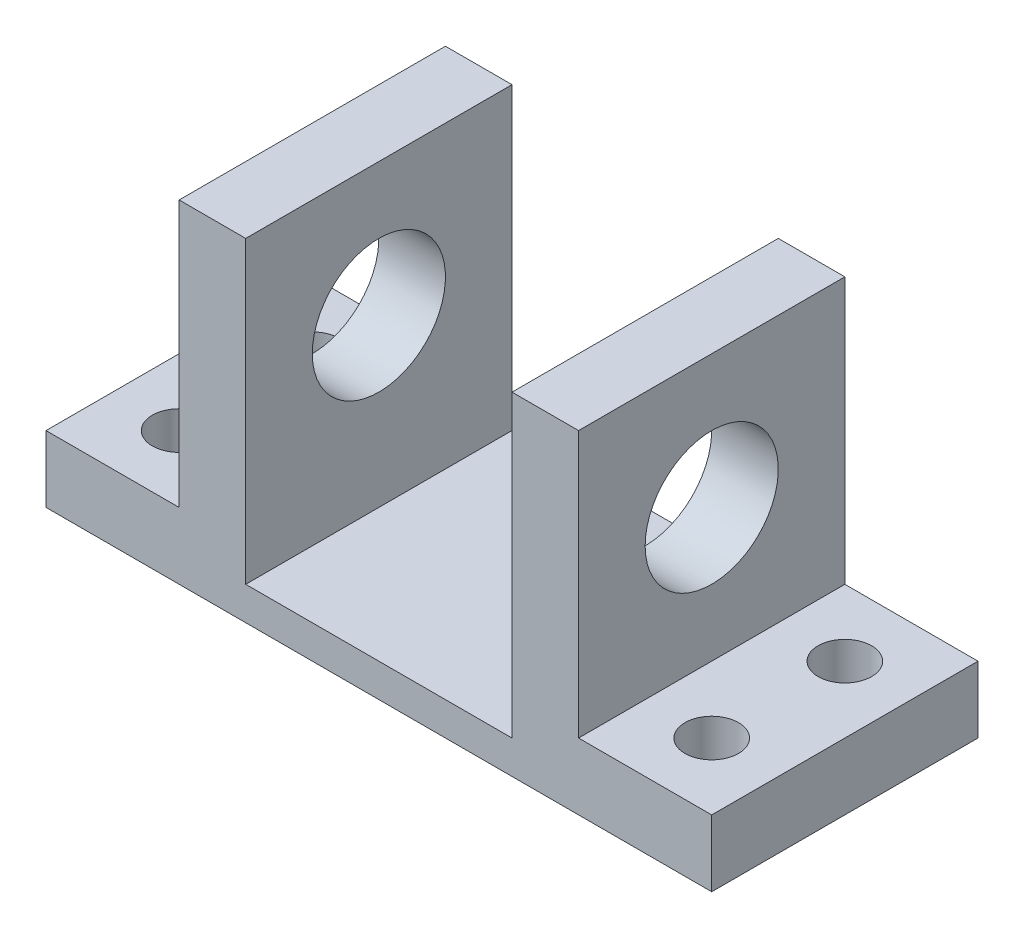
ISO-10303-21;
HEADER;
FILE_DESCRIPTION(('STEP AP214'),'2;1');
FILE_NAME('part.step','',(''),(''),'','','');
FILE_SCHEMA(('AUTOMOTIVE_DESIGN { 1 0 10303 214 1 1 1 1 }'));
ENDSEC;
DATA;
#1=APPLICATION_CONTEXT('core data for automotive mechanical design processes');
#2=APPLICATION_PROTOCOL_DEFINITION('international standard','automotive_design',2000,#1);
#3=PRODUCT_CONTEXT('',#1,'mechanical');
#4=PRODUCT('Part','Part','',(#3));
#5=PRODUCT_RELATED_PRODUCT_CATEGORY('part','',(#4));
#6=PRODUCT_DEFINITION_FORMATION('','',#4);
#7=PRODUCT_DEFINITION_CONTEXT('part definition',#1,'design');
#8=PRODUCT_DEFINITION('design','',#6,#7);
#9=PRODUCT_DEFINITION_SHAPE('','',#8);
#10=(LENGTH_UNIT() NAMED_UNIT(*) SI_UNIT(.MILLI.,.METRE.));
#11=(NAMED_UNIT(*) PLANE_ANGLE_UNIT() SI_UNIT($,.RADIAN.));
#12=(NAMED_UNIT(*) SI_UNIT($,.STERADIAN.) SOLID_ANGLE_UNIT());
#13=UNCERTAINTY_MEASURE_WITH_UNIT(LENGTH_MEASURE(1.E-05),#10,'distance_accuracy_value','');
#14=(GEOMETRIC_REPRESENTATION_CONTEXT(3) GLOBAL_UNCERTAINTY_ASSIGNED_CONTEXT((#13)) GLOBAL_UNIT_ASSIGNED_CONTEXT((#10,
#11,#12)) REPRESENTATION_CONTEXT('',''));
#15=CARTESIAN_POINT('',(0.,0.,0.));
#16=DIRECTION('',(0.,0.,1.));
#17=DIRECTION('',(1.,0.,0.));
#18=AXIS2_PLACEMENT_3D('',#15,#16,#17);
#19=CARTESIAN_POINT('',(38.1,31.75,0.));
#20=DIRECTION('',(-1.,0.,0.));
#21=DIRECTION('',(0.,0.,1.));
#22=AXIS2_PLACEMENT_3D('',#19,#20,#21);
#23=PLANE('',#22);
#24=CARTESIAN_POINT('',(38.1,19.05,-12.7));
#25=DIRECTION('',(-1.,0.,0.));
#26=DIRECTION('',(0.,0.,1.));
#27=AXIS2_PLACEMENT_3D('',#24,#25,#26);
#28=CIRCLE('',#27,6.35);
#29=CARTESIAN_POINT('',(38.1,19.05,-6.35));
#30=VERTEX_POINT('',#29);
#31=EDGE_CURVE('E197',#30,#30,#28,.T.);
#32=ORIENTED_EDGE('',*,*,#31,.T.);
#33=EDGE_LOOP('',(#32));
#34=FACE_BOUND('',#33,.T.);
#35=DIRECTION('',(0.,0.,1.));
#36=VECTOR('',#35,1.);
#37=CARTESIAN_POINT('',(38.1,6.35,0.));
#38=LINE('',#37,#36);
#39=CARTESIAN_POINT('',(38.1,6.35,-25.4));
#40=VERTEX_POINT('',#39);
#41=CARTESIAN_POINT('',(38.1,6.35,0.));
#42=VERTEX_POINT('',#41);
#43=EDGE_CURVE('E54',#40,#42,#38,.T.);
#44=ORIENTED_EDGE('',*,*,#43,.F.);
#45=DIRECTION('',(0.,-1.,0.));
#46=VECTOR('',#45,1.);
#47=CARTESIAN_POINT('',(38.1,31.75,-25.4));
#48=LINE('',#47,#46);
#49=CARTESIAN_POINT('',(38.1,31.75,-25.4));
#50=VERTEX_POINT('',#49);
#51=EDGE_CURVE('E227',#50,#40,#48,.T.);
#52=ORIENTED_EDGE('',*,*,#51,.F.);
#53=DIRECTION('',(0.,0.,-1.));
#54=VECTOR('',#53,1.);
#55=CARTESIAN_POINT('',(38.1,31.75,0.));
#56=LINE('',#55,#54);
#57=CARTESIAN_POINT('',(38.1,31.75,0.));
#58=VERTEX_POINT('',#57);
#59=EDGE_CURVE('E215',#58,#50,#56,.T.);
#60=ORIENTED_EDGE('',*,*,#59,.F.);
#61=DIRECTION('',(0.,-1.,0.));
#62=VECTOR('',#61,1.);
#63=CARTESIAN_POINT('',(38.1,31.75,0.));
#64=LINE('',#63,#62);
#65=EDGE_CURVE('E168',#58,#42,#64,.T.);
#66=ORIENTED_EDGE('',*,*,#65,.T.);
#67=EDGE_LOOP('',(#44,#52,#60,#66));
#68=FACE_BOUND('',#67,.T.);
#69=ADVANCED_FACE('F37',(#34,#68),#23,.F.);
#70=CARTESIAN_POINT('',(0.,31.75,-25.4));
#71=DIRECTION('',(0.,0.,-1.));
#72=DIRECTION('',(-1.,0.,0.));
#73=AXIS2_PLACEMENT_3D('',#70,#71,#72);
#74=PLANE('',#73);
#75=DIRECTION('',(1.,0.,0.));
#76=VECTOR('',#75,1.);
#77=CARTESIAN_POINT('',(0.,0.,-25.4));
#78=LINE('',#77,#76);
#79=CARTESIAN_POINT('',(-12.7,0.,-25.4));
#80=VERTEX_POINT('',#79);
#81=CARTESIAN_POINT('',(50.8,0.,-25.4));
#82=VERTEX_POINT('',#81);
#83=EDGE_CURVE('E140',#80,#82,#78,.T.);
#84=ORIENTED_EDGE('',*,*,#83,.F.);
#85=DIRECTION('',(0.,-1.,0.));
#86=VECTOR('',#85,1.);
#87=CARTESIAN_POINT('',(-12.7,0.,-25.4));
#88=LINE('',#87,#86);
#89=CARTESIAN_POINT('',(-12.7,6.35,-25.4));
#90=VERTEX_POINT('',#89);
#91=EDGE_CURVE('E164',#90,#80,#88,.T.);
#92=ORIENTED_EDGE('',*,*,#91,.F.);
#93=DIRECTION('',(1.,0.,0.));
#94=VECTOR('',#93,1.);
#95=CARTESIAN_POINT('',(-12.7,6.35,-25.4));
#96=LINE('',#95,#94);
#97=CARTESIAN_POINT('',(0.,6.35,-25.4));
#98=VERTEX_POINT('',#97);
#99=EDGE_CURVE('E190',#90,#98,#96,.T.);
#100=ORIENTED_EDGE('',*,*,#99,.T.);
#101=DIRECTION('',(0.,-1.,0.));
#102=VECTOR('',#101,1.);
#103=CARTESIAN_POINT('',(0.,31.75,-25.4));
#104=LINE('',#103,#102);
#105=CARTESIAN_POINT('',(0.,31.75,-25.4));
#106=VERTEX_POINT('',#105);
#107=EDGE_CURVE('E11',#106,#98,#104,.T.);
#108=ORIENTED_EDGE('',*,*,#107,.F.);
#109=DIRECTION('',(1.,0.,0.));
#110=VECTOR('',#109,1.);
#111=CARTESIAN_POINT('',(0.,31.75,-25.4));
#112=LINE('',#111,#110);
#113=CARTESIAN_POINT('',(6.35,31.75,-25.4));
#114=VERTEX_POINT('',#113);
#115=EDGE_CURVE('E139',#106,#114,#112,.T.);
#116=ORIENTED_EDGE('',*,*,#115,.T.);
#117=DIRECTION('',(0.,-1.,0.));
#118=VECTOR('',#117,1.);
#119=CARTESIAN_POINT('',(6.35,31.75,-25.4));
#120=LINE('',#119,#118);
#121=CARTESIAN_POINT('',(6.35,3.175,-25.4));
#122=VERTEX_POINT('',#121);
#123=EDGE_CURVE('E250',#114,#122,#120,.T.);
#124=ORIENTED_EDGE('',*,*,#123,.T.);
#125=DIRECTION('',(1.,0.,0.));
#126=VECTOR('',#125,1.);
#127=CARTESIAN_POINT('',(0.,3.175,-25.4));
#128=LINE('',#127,#126);
#129=CARTESIAN_POINT('',(31.75,3.175,-25.4));
#130=VERTEX_POINT('',#129);
#131=EDGE_CURVE('E238',#122,#130,#128,.T.);
#132=ORIENTED_EDGE('',*,*,#131,.T.);
#133=DIRECTION('',(0.,-1.,0.));
#134=VECTOR('',#133,1.);
#135=CARTESIAN_POINT('',(31.75,31.75,-25.4));
#136=LINE('',#135,#134);
#137=CARTESIAN_POINT('',(31.75,31.75,-25.4));
#138=VERTEX_POINT('',#137);
#139=EDGE_CURVE('E220',#138,#130,#136,.T.);
#140=ORIENTED_EDGE('',*,*,#139,.F.);
#141=DIRECTION('',(1.,0.,0.));
#142=VECTOR('',#141,1.);
#143=CARTESIAN_POINT('',(0.,31.75,-25.4));
#144=LINE('',#143,#142);
#145=EDGE_CURVE('E217',#138,#50,#144,.T.);
#146=ORIENTED_EDGE('',*,*,#145,.T.);
#147=ORIENTED_EDGE('',*,*,#51,.T.);
#148=DIRECTION('',(-1.,0.,0.));
#149=VECTOR('',#148,1.);
#150=CARTESIAN_POINT('',(50.8,6.35,-25.4));
#151=LINE('',#150,#149);
#152=CARTESIAN_POINT('',(50.8,6.35,-25.4));
#153=VERTEX_POINT('',#152);
#154=EDGE_CURVE('E172',#153,#40,#151,.T.);
#155=ORIENTED_EDGE('',*,*,#154,.F.);
#156=DIRECTION('',(0.,1.,0.));
#157=VECTOR('',#156,1.);
#158=CARTESIAN_POINT('',(50.8,0.,-25.4));
#159=LINE('',#158,#157);
#160=EDGE_CURVE('E147',#82,#153,#159,.T.);
#161=ORIENTED_EDGE('',*,*,#160,.F.);
#162=EDGE_LOOP('',(#84,#92,#100,#108,#116,#124,#132,#140,#146,#147,#155,#161));
#163=FACE_BOUND('',#162,.T.);
#164=ADVANCED_FACE('F39',(#163),#74,.T.);
#165=CARTESIAN_POINT('',(0.,31.75,0.));
#166=DIRECTION('',(-1.,0.,0.));
#167=DIRECTION('',(0.,0.,1.));
#168=AXIS2_PLACEMENT_3D('',#165,#166,#167);
#169=PLANE('',#168);
#170=DIRECTION('',(0.,0.,-1.));
#171=VECTOR('',#170,1.);
#172=CARTESIAN_POINT('',(0.,6.35,-25.4));
#173=LINE('',#172,#171);
#174=CARTESIAN_POINT('',(0.,6.35,0.));
#175=VERTEX_POINT('',#174);
#176=EDGE_CURVE('E61',#175,#98,#173,.T.);
#177=ORIENTED_EDGE('',*,*,#176,.F.);
#178=DIRECTION('',(0.,-1.,0.));
#179=VECTOR('',#178,1.);
#180=CARTESIAN_POINT('',(0.,31.75,0.));
#181=LINE('',#180,#179);
#182=CARTESIAN_POINT('',(0.,31.75,0.));
#183=VERTEX_POINT('',#182);
#184=EDGE_CURVE('E46',#183,#175,#181,.T.);
#185=ORIENTED_EDGE('',*,*,#184,.F.);
#186=DIRECTION('',(0.,0.,-1.));
#187=VECTOR('',#186,1.);
#188=CARTESIAN_POINT('',(0.,31.75,0.));
#189=LINE('',#188,#187);
#190=EDGE_CURVE('E262',#183,#106,#189,.T.);
#191=ORIENTED_EDGE('',*,*,#190,.T.);
#192=ORIENTED_EDGE('',*,*,#107,.T.);
#193=EDGE_LOOP('',(#177,#185,#191,#192));
#194=FACE_BOUND('',#193,.T.);
#195=CARTESIAN_POINT('',(0.,19.05,-12.7));
#196=DIRECTION('',(-1.,0.,0.));
#197=DIRECTION('',(0.,0.,1.));
#198=AXIS2_PLACEMENT_3D('',#195,#196,#197);
#199=CIRCLE('',#198,6.35);
#200=CARTESIAN_POINT('',(0.,19.05,-6.35));
#201=VERTEX_POINT('',#200);
#202=EDGE_CURVE('E201',#201,#201,#199,.T.);
#203=ORIENTED_EDGE('',*,*,#202,.F.);
#204=EDGE_LOOP('',(#203));
#205=FACE_BOUND('',#204,.T.);
#206=ADVANCED_FACE('F273',(#194,#205),#169,.T.);
#207=CARTESIAN_POINT('',(0.,31.75,0.));
#208=DIRECTION('',(0.,0.,-1.));
#209=DIRECTION('',(-1.,0.,0.));
#210=AXIS2_PLACEMENT_3D('',#207,#208,#209);
#211=PLANE('',#210);
#212=DIRECTION('',(1.,0.,0.));
#213=VECTOR('',#212,1.);
#214=CARTESIAN_POINT('',(0.,0.,0.));
#215=LINE('',#214,#213);
#216=CARTESIAN_POINT('',(-12.7,0.,0.));
#217=VERTEX_POINT('',#216);
#218=CARTESIAN_POINT('',(50.8,0.,0.));
#219=VERTEX_POINT('',#218);
#220=EDGE_CURVE('E128',#217,#219,#215,.T.);
#221=ORIENTED_EDGE('',*,*,#220,.T.);
#222=DIRECTION('',(0.,-1.,0.));
#223=VECTOR('',#222,1.);
#224=CARTESIAN_POINT('',(50.8,0.,0.));
#225=LINE('',#224,#223);
#226=CARTESIAN_POINT('',(50.8,6.35,0.));
#227=VERTEX_POINT('',#226);
#228=EDGE_CURVE('E133',#227,#219,#225,.T.);
#229=ORIENTED_EDGE('',*,*,#228,.F.);
#230=DIRECTION('',(-1.,0.,0.));
#231=VECTOR('',#230,1.);
#232=CARTESIAN_POINT('',(50.8,6.35,0.));
#233=LINE('',#232,#231);
#234=EDGE_CURVE('E161',#227,#42,#233,.T.);
#235=ORIENTED_EDGE('',*,*,#234,.T.);
#236=ORIENTED_EDGE('',*,*,#65,.F.);
#237=DIRECTION('',(1.,0.,0.));
#238=VECTOR('',#237,1.);
#239=CARTESIAN_POINT('',(0.,31.75,0.));
#240=LINE('',#239,#238);
#241=CARTESIAN_POINT('',(31.75,31.75,0.));
#242=VERTEX_POINT('',#241);
#243=EDGE_CURVE('E213',#242,#58,#240,.T.);
#244=ORIENTED_EDGE('',*,*,#243,.F.);
#245=DIRECTION('',(0.,-1.,0.));
#246=VECTOR('',#245,1.);
#247=CARTESIAN_POINT('',(31.75,31.75,0.));
#248=LINE('',#247,#246);
#249=CARTESIAN_POINT('',(31.75,3.175,0.));
#250=VERTEX_POINT('',#249);
#251=EDGE_CURVE('E228',#242,#250,#248,.T.);
#252=ORIENTED_EDGE('',*,*,#251,.T.);
#253=DIRECTION('',(1.,0.,0.));
#254=VECTOR('',#253,1.);
#255=CARTESIAN_POINT('',(0.,3.175,0.));
#256=LINE('',#255,#254);
#257=CARTESIAN_POINT('',(6.35,3.175,0.));
#258=VERTEX_POINT('',#257);
#259=EDGE_CURVE('E239',#258,#250,#256,.T.);
#260=ORIENTED_EDGE('',*,*,#259,.F.);
#261=DIRECTION('',(0.,-1.,0.));
#262=VECTOR('',#261,1.);
#263=CARTESIAN_POINT('',(6.35,31.75,0.));
#264=LINE('',#263,#262);
#265=CARTESIAN_POINT('',(6.35,31.75,0.));
#266=VERTEX_POINT('',#265);
#267=EDGE_CURVE('E243',#266,#258,#264,.T.);
#268=ORIENTED_EDGE('',*,*,#267,.F.);
#269=DIRECTION('',(1.,0.,0.));
#270=VECTOR('',#269,1.);
#271=CARTESIAN_POINT('',(0.,31.75,0.));
#272=LINE('',#271,#270);
#273=EDGE_CURVE('E260',#183,#266,#272,.T.);
#274=ORIENTED_EDGE('',*,*,#273,.F.);
#275=ORIENTED_EDGE('',*,*,#184,.T.);
#276=DIRECTION('',(1.,0.,0.));
#277=VECTOR('',#276,1.);
#278=CARTESIAN_POINT('',(-12.7,6.35,0.));
#279=LINE('',#278,#277);
#280=CARTESIAN_POINT('',(-12.7,6.35,0.));
#281=VERTEX_POINT('',#280);
#282=EDGE_CURVE('E204',#281,#175,#279,.T.);
#283=ORIENTED_EDGE('',*,*,#282,.F.);
#284=DIRECTION('',(0.,1.,0.));
#285=VECTOR('',#284,1.);
#286=CARTESIAN_POINT('',(-12.7,0.,0.));
#287=LINE('',#286,#285);
#288=EDGE_CURVE('E135',#217,#281,#287,.T.);
#289=ORIENTED_EDGE('',*,*,#288,.F.);
#290=EDGE_LOOP('',(#221,#229,#235,#236,#244,#252,#260,#268,#274,#275,#283,#289));
#291=FACE_BOUND('',#290,.T.);
#292=ADVANCED_FACE('F130',(#291),#211,.F.);
#293=CARTESIAN_POINT('',(6.35,31.75,0.));
#294=DIRECTION('',(-1.,0.,0.));
#295=DIRECTION('',(0.,0.,1.));
#296=AXIS2_PLACEMENT_3D('',#293,#294,#295);
#297=PLANE('',#296);
#298=CARTESIAN_POINT('',(6.35,19.05,-12.7));
#299=DIRECTION('',(-1.,0.,0.));
#300=DIRECTION('',(0.,0.,1.));
#301=AXIS2_PLACEMENT_3D('',#298,#299,#300);
#302=CIRCLE('',#301,6.35);
#303=CARTESIAN_POINT('',(6.35000000000001,19.05,-6.35));
#304=VERTEX_POINT('',#303);
#305=EDGE_CURVE('E207',#304,#304,#302,.T.);
#306=ORIENTED_EDGE('',*,*,#305,.T.);
#307=EDGE_LOOP('',(#306));
#308=FACE_BOUND('',#307,.T.);
#309=ORIENTED_EDGE('',*,*,#267,.T.);
#310=DIRECTION('',(0.,0.,-1.));
#311=VECTOR('',#310,1.);
#312=CARTESIAN_POINT('',(6.35,3.175,0.));
#313=LINE('',#312,#311);
#314=EDGE_CURVE('E258',#258,#122,#313,.T.);
#315=ORIENTED_EDGE('',*,*,#314,.T.);
#316=ORIENTED_EDGE('',*,*,#123,.F.);
#317=DIRECTION('',(0.,0.,-1.));
#318=VECTOR('',#317,1.);
#319=CARTESIAN_POINT('',(6.35,31.75,0.));
#320=LINE('',#319,#318);
#321=EDGE_CURVE('E253',#266,#114,#320,.T.);
#322=ORIENTED_EDGE('',*,*,#321,.F.);
#323=EDGE_LOOP('',(#309,#315,#316,#322));
#324=FACE_BOUND('',#323,.T.);
#325=ADVANCED_FACE('F283',(#308,#324),#297,.F.);
#326=CARTESIAN_POINT('',(0.,31.75,0.));
#327=DIRECTION('',(0.,1.,0.));
#328=DIRECTION('',(0.,0.,1.));
#329=AXIS2_PLACEMENT_3D('',#326,#327,#328);
#330=PLANE('',#329);
#331=ORIENTED_EDGE('',*,*,#115,.F.);
#332=ORIENTED_EDGE('',*,*,#190,.F.);
#333=ORIENTED_EDGE('',*,*,#273,.T.);
#334=ORIENTED_EDGE('',*,*,#321,.T.);
#335=EDGE_LOOP('',(#331,#332,#333,#334));
#336=FACE_BOUND('',#335,.T.);
#337=ADVANCED_FACE('F271',(#336),#330,.T.);
#338=CARTESIAN_POINT('',(0.,0.,0.));
#339=DIRECTION('',(0.,1.,0.));
#340=DIRECTION('',(0.,0.,1.));
#341=AXIS2_PLACEMENT_3D('',#338,#339,#340);
#342=PLANE('',#341);
#343=CARTESIAN_POINT('',(-6.35,0.,-19.05));
#344=DIRECTION('',(0.,1.,0.));
#345=DIRECTION('',(0.,0.,1.));
#346=AXIS2_PLACEMENT_3D('',#343,#344,#345);
#347=CIRCLE('',#346,2.55269999999999);
#348=CARTESIAN_POINT('',(-6.35,0.,-16.4973));
#349=VERTEX_POINT('',#348);
#350=EDGE_CURVE('E366',#349,#349,#347,.T.);
#351=ORIENTED_EDGE('',*,*,#350,.T.);
#352=EDGE_LOOP('',(#351));
#353=FACE_BOUND('',#352,.T.);
#354=CARTESIAN_POINT('',(-6.35,0.,-6.35));
#355=DIRECTION('',(0.,1.,0.));
#356=DIRECTION('',(0.,0.,1.));
#357=AXIS2_PLACEMENT_3D('',#354,#355,#356);
#358=CIRCLE('',#357,2.55269999999999);
#359=CARTESIAN_POINT('',(-6.35,0.,-3.79730000000001));
#360=VERTEX_POINT('',#359);
#361=EDGE_CURVE('E41',#360,#360,#358,.T.);
#362=ORIENTED_EDGE('',*,*,#361,.T.);
#363=EDGE_LOOP('',(#362));
#364=FACE_BOUND('',#363,.T.);
#365=CARTESIAN_POINT('',(44.45,0.,-6.35));
#366=DIRECTION('',(0.,1.,0.));
#367=DIRECTION('',(0.,0.,1.));
#368=AXIS2_PLACEMENT_3D('',#365,#366,#367);
#369=CIRCLE('',#368,2.55269999999999);
#370=CARTESIAN_POINT('',(44.45,0.,-3.79730000000001));
#371=VERTEX_POINT('',#370);
#372=EDGE_CURVE('E376',#371,#371,#369,.T.);
#373=ORIENTED_EDGE('',*,*,#372,.T.);
#374=EDGE_LOOP('',(#373));
#375=FACE_BOUND('',#374,.T.);
#376=CARTESIAN_POINT('',(44.45,0.,-19.05));
#377=DIRECTION('',(0.,1.,0.));
#378=DIRECTION('',(0.,0.,1.));
#379=AXIS2_PLACEMENT_3D('',#376,#377,#378);
#380=CIRCLE('',#379,2.55269999999999);
#381=CARTESIAN_POINT('',(44.45,0.,-16.4973));
#382=VERTEX_POINT('',#381);
#383=EDGE_CURVE('E154',#382,#382,#380,.T.);
#384=ORIENTED_EDGE('',*,*,#383,.T.);
#385=EDGE_LOOP('',(#384));
#386=FACE_BOUND('',#385,.T.);
#387=ORIENTED_EDGE('',*,*,#83,.T.);
#388=DIRECTION('',(0.,0.,-1.));
#389=VECTOR('',#388,1.);
#390=CARTESIAN_POINT('',(50.8,0.,0.));
#391=LINE('',#390,#389);
#392=EDGE_CURVE('E143',#219,#82,#391,.T.);
#393=ORIENTED_EDGE('',*,*,#392,.F.);
#394=ORIENTED_EDGE('',*,*,#220,.F.);
#395=DIRECTION('',(0.,0.,1.));
#396=VECTOR('',#395,1.);
#397=CARTESIAN_POINT('',(-12.7,0.,-25.4));
#398=LINE('',#397,#396);
#399=EDGE_CURVE('E185',#80,#217,#398,.T.);
#400=ORIENTED_EDGE('',*,*,#399,.F.);
#401=EDGE_LOOP('',(#387,#393,#394,#400));
#402=FACE_BOUND('',#401,.T.);
#403=ADVANCED_FACE('F144',(#353,#364,#375,#386,#402),#342,.F.);
#404=CARTESIAN_POINT('',(0.,3.175,0.));
#405=DIRECTION('',(0.,1.,0.));
#406=DIRECTION('',(0.,0.,1.));
#407=AXIS2_PLACEMENT_3D('',#404,#405,#406);
#408=PLANE('',#407);
#409=ORIENTED_EDGE('',*,*,#259,.T.);
#410=DIRECTION('',(0.,0.,-1.));
#411=VECTOR('',#410,1.);
#412=CARTESIAN_POINT('',(31.75,3.175,0.));
#413=LINE('',#412,#411);
#414=EDGE_CURVE('E235',#250,#130,#413,.T.);
#415=ORIENTED_EDGE('',*,*,#414,.T.);
#416=ORIENTED_EDGE('',*,*,#131,.F.);
#417=ORIENTED_EDGE('',*,*,#314,.F.);
#418=EDGE_LOOP('',(#409,#415,#416,#417));
#419=FACE_BOUND('',#418,.T.);
#420=ADVANCED_FACE('F306',(#419),#408,.T.);
#421=CARTESIAN_POINT('',(31.75,31.75,0.));
#422=DIRECTION('',(-1.,0.,0.));
#423=DIRECTION('',(0.,0.,1.));
#424=AXIS2_PLACEMENT_3D('',#421,#422,#423);
#425=PLANE('',#424);
#426=CARTESIAN_POINT('',(31.75,19.05,-12.7));
#427=DIRECTION('',(-1.,0.,0.));
#428=DIRECTION('',(0.,0.,1.));
#429=AXIS2_PLACEMENT_3D('',#426,#427,#428);
#430=CIRCLE('',#429,6.35);
#431=CARTESIAN_POINT('',(31.75,19.05,-6.35));
#432=VERTEX_POINT('',#431);
#433=EDGE_CURVE('E200',#432,#432,#430,.T.);
#434=ORIENTED_EDGE('',*,*,#433,.F.);
#435=EDGE_LOOP('',(#434));
#436=FACE_BOUND('',#435,.T.);
#437=ORIENTED_EDGE('',*,*,#414,.F.);
#438=ORIENTED_EDGE('',*,*,#251,.F.);
#439=DIRECTION('',(0.,0.,-1.));
#440=VECTOR('',#439,1.);
#441=CARTESIAN_POINT('',(31.75,31.75,0.));
#442=LINE('',#441,#440);
#443=EDGE_CURVE('E210',#242,#138,#442,.T.);
#444=ORIENTED_EDGE('',*,*,#443,.T.);
#445=ORIENTED_EDGE('',*,*,#139,.T.);
#446=EDGE_LOOP('',(#437,#438,#444,#445));
#447=FACE_BOUND('',#446,.T.);
#448=ADVANCED_FACE('F305',(#436,#447),#425,.T.);
#449=CARTESIAN_POINT('',(0.,31.75,0.));
#450=DIRECTION('',(0.,1.,0.));
#451=DIRECTION('',(0.,0.,1.));
#452=AXIS2_PLACEMENT_3D('',#449,#450,#451);
#453=PLANE('',#452);
#454=ORIENTED_EDGE('',*,*,#443,.F.);
#455=ORIENTED_EDGE('',*,*,#243,.T.);
#456=ORIENTED_EDGE('',*,*,#59,.T.);
#457=ORIENTED_EDGE('',*,*,#145,.F.);
#458=EDGE_LOOP('',(#454,#455,#456,#457));
#459=FACE_BOUND('',#458,.T.);
#460=ADVANCED_FACE('F303',(#459),#453,.T.);
#461=CARTESIAN_POINT('',(38.1,19.05,-12.7));
#462=DIRECTION('',(-1.,0.,0.));
#463=DIRECTION('',(0.,0.,1.));
#464=AXIS2_PLACEMENT_3D('',#461,#462,#463);
#465=CYLINDRICAL_SURFACE('',#464,6.35);
#466=CARTESIAN_POINT('',(31.75,19.05,-6.35));
#467=CARTESIAN_POINT('',(31.8161458333333,19.05,-6.35));
#468=CARTESIAN_POINT('',(31.8822916666667,19.05,-6.35));
#469=CARTESIAN_POINT('',(32.0145833333333,19.05,-6.35));
#470=CARTESIAN_POINT('',(32.0807291666667,19.05,-6.35));
#471=CARTESIAN_POINT('',(32.2130208333333,19.05,-6.35));
#472=CARTESIAN_POINT('',(32.2791666666667,19.05,-6.35));
#473=CARTESIAN_POINT('',(32.4114583333333,19.05,-6.35));
#474=CARTESIAN_POINT('',(32.4776041666667,19.05,-6.35));
#475=CARTESIAN_POINT('',(32.6098958333333,19.05,-6.35));
#476=CARTESIAN_POINT('',(32.6760416666667,19.05,-6.35));
#477=CARTESIAN_POINT('',(32.8083333333333,19.05,-6.35));
#478=CARTESIAN_POINT('',(32.8744791666667,19.05,-6.35));
#479=CARTESIAN_POINT('',(33.0067708333333,19.05,-6.35));
#480=CARTESIAN_POINT('',(33.0729166666667,19.05,-6.35));
#481=CARTESIAN_POINT('',(33.2052083333333,19.05,-6.35));
#482=CARTESIAN_POINT('',(33.2713541666667,19.05,-6.35));
#483=CARTESIAN_POINT('',(33.4036458333333,19.05,-6.35));
#484=CARTESIAN_POINT('',(33.4697916666667,19.05,-6.35));
#485=CARTESIAN_POINT('',(33.6020833333333,19.05,-6.35));
#486=CARTESIAN_POINT('',(33.6682291666667,19.05,-6.35));
#487=CARTESIAN_POINT('',(33.8005208333333,19.05,-6.35));
#488=CARTESIAN_POINT('',(33.8666666666667,19.05,-6.35));
#489=CARTESIAN_POINT('',(33.9989583333333,19.05,-6.35));
#490=CARTESIAN_POINT('',(34.0651041666667,19.05,-6.35));
#491=CARTESIAN_POINT('',(34.1973958333333,19.05,-6.35));
#492=CARTESIAN_POINT('',(34.2635416666667,19.05,-6.35));
#493=CARTESIAN_POINT('',(34.3958333333333,19.05,-6.35));
#494=CARTESIAN_POINT('',(34.4619791666667,19.05,-6.35));
#495=CARTESIAN_POINT('',(34.5942708333333,19.05,-6.35));
#496=CARTESIAN_POINT('',(34.6604166666667,19.05,-6.35));
#497=CARTESIAN_POINT('',(34.7927083333333,19.05,-6.35));
#498=CARTESIAN_POINT('',(34.8588541666667,19.05,-6.35));
#499=CARTESIAN_POINT('',(34.9911458333333,19.05,-6.35));
#500=CARTESIAN_POINT('',(35.0572916666667,19.05,-6.35));
#501=CARTESIAN_POINT('',(35.1895833333333,19.05,-6.35));
#502=CARTESIAN_POINT('',(35.2557291666667,19.05,-6.35));
#503=CARTESIAN_POINT('',(35.3880208333333,19.05,-6.35));
#504=CARTESIAN_POINT('',(35.4541666666667,19.05,-6.35));
#505=CARTESIAN_POINT('',(35.5864583333333,19.05,-6.35));
#506=CARTESIAN_POINT('',(35.6526041666667,19.05,-6.35));
#507=CARTESIAN_POINT('',(35.7848958333333,19.05,-6.35));
#508=CARTESIAN_POINT('',(35.8510416666667,19.05,-6.35));
#509=CARTESIAN_POINT('',(35.9833333333333,19.05,-6.35));
#510=CARTESIAN_POINT('',(36.0494791666667,19.05,-6.35));
#511=CARTESIAN_POINT('',(36.1817708333333,19.05,-6.35));
#512=CARTESIAN_POINT('',(36.2479166666667,19.05,-6.35));
#513=CARTESIAN_POINT('',(36.3802083333333,19.05,-6.35));
#514=CARTESIAN_POINT('',(36.4463541666667,19.05,-6.35));
#515=CARTESIAN_POINT('',(36.5786458333333,19.05,-6.35));
#516=CARTESIAN_POINT('',(36.6447916666667,19.05,-6.35));
#517=CARTESIAN_POINT('',(36.7770833333333,19.05,-6.35));
#518=CARTESIAN_POINT('',(36.8432291666667,19.05,-6.35));
#519=CARTESIAN_POINT('',(36.9755208333333,19.05,-6.35));
#520=CARTESIAN_POINT('',(37.0416666666667,19.05,-6.35));
#521=CARTESIAN_POINT('',(37.1739583333333,19.05,-6.35));
#522=CARTESIAN_POINT('',(37.2401041666667,19.05,-6.35));
#523=CARTESIAN_POINT('',(37.3723958333333,19.05,-6.35));
#524=CARTESIAN_POINT('',(37.4385416666667,19.05,-6.35));
#525=CARTESIAN_POINT('',(37.5708333333333,19.05,-6.35));
#526=CARTESIAN_POINT('',(37.6369791666667,19.05,-6.35));
#527=CARTESIAN_POINT('',(37.7692708333333,19.05,-6.35));
#528=CARTESIAN_POINT('',(37.8354166666667,19.05,-6.35));
#529=CARTESIAN_POINT('',(37.9677083333333,19.05,-6.35));
#530=CARTESIAN_POINT('',(38.0338541666667,19.05,-6.35));
#531=CARTESIAN_POINT('',(38.1,19.05,-6.35));
#532=B_SPLINE_CURVE_WITH_KNOTS('',3,(#466,#467,#468,#469,#470,#471,#472,#473,#474,#475,#476,
#477,#478,#479,#480,#481,#482,#483,#484,#485,#486,#487,#488,#489,#490,#491,#492,#493,#494,#495,
#496,#497,#498,#499,#500,#501,#502,#503,#504,#505,#506,#507,#508,#509,#510,#511,#512,#513,#514,
#515,#516,#517,#518,#519,#520,#521,#522,#523,#524,#525,#526,#527,#528,#529,#530,#531),
.UNSPECIFIED.,.F.,.F.,(4,2,2,2,2,2,2,2,2,2,2,2,2,2,2,2,2,2,2,2,2,2,2,2,2,2,2,2,2,2,2,2,4),(0.,
0.198437499999995,0.396874999999998,0.5953125,0.793749999999996,0.992187499999998,1.190625,
1.3890625,1.5875,1.78593749999999,1.984375,2.1828125,2.38124999999999,2.5796875,2.778125,
2.97656249999999,3.175,3.3734375,3.571875,3.7703125,3.96875,4.1671875,4.365625,4.5640625,4.7625,
4.9609375,5.159375,5.3578125,5.55625,5.7546875,5.953125,6.1515625,6.34999999999999),.UNSPECIFIED.);
#533=EDGE_CURVE('BSEAM327',#432,#30,#532,.T.);
#534=ORIENTED_EDGE('',*,*,#433,.T.);
#535=ORIENTED_EDGE('',*,*,#31,.F.);
#536=ORIENTED_EDGE('',*,*,#533,.T.);
#537=ORIENTED_EDGE('',*,*,#533,.F.);
#538=EDGE_LOOP('',(#534,#536,#535,#537));
#539=FACE_BOUND('',#538,.T.);
#540=ADVANCED_FACE('F327',(#539),#465,.F.);
#541=CARTESIAN_POINT('',(0.,19.05,-6.35));
#542=CARTESIAN_POINT('',(0.0661458333333341,19.05,-6.35));
#543=CARTESIAN_POINT('',(0.132291666666668,19.05,-6.35));
#544=CARTESIAN_POINT('',(0.264583333333334,19.05,-6.35));
#545=CARTESIAN_POINT('',(0.330729166666666,19.05,-6.35));
#546=CARTESIAN_POINT('',(0.463020833333332,19.05,-6.35));
#547=CARTESIAN_POINT('',(0.529166666666666,19.05,-6.35));
#548=CARTESIAN_POINT('',(0.661458333333334,19.05,-6.35));
#549=CARTESIAN_POINT('',(0.727604166666669,19.05,-6.35));
#550=CARTESIAN_POINT('',(0.859895833333335,19.05,-6.35));
#551=CARTESIAN_POINT('',(0.926041666666666,19.05,-6.35));
#552=CARTESIAN_POINT('',(1.05833333333333,19.05,-6.35));
#553=CARTESIAN_POINT('',(1.12447916666667,19.05,-6.35));
#554=CARTESIAN_POINT('',(1.25677083333333,19.05,-6.35));
#555=CARTESIAN_POINT('',(1.32291666666667,19.05,-6.35));
#556=CARTESIAN_POINT('',(1.45520833333334,19.05,-6.35));
#557=CARTESIAN_POINT('',(1.52135416666667,19.05,-6.35));
#558=CARTESIAN_POINT('',(1.65364583333334,19.05,-6.35));
#559=CARTESIAN_POINT('',(1.71979166666667,19.05,-6.35));
#560=CARTESIAN_POINT('',(1.85208333333334,19.05,-6.35));
#561=CARTESIAN_POINT('',(1.91822916666667,19.05,-6.35));
#562=CARTESIAN_POINT('',(2.05052083333334,19.05,-6.35));
#563=CARTESIAN_POINT('',(2.11666666666667,19.05,-6.35));
#564=CARTESIAN_POINT('',(2.24895833333334,19.05,-6.35));
#565=CARTESIAN_POINT('',(2.31510416666667,19.05,-6.35));
#566=CARTESIAN_POINT('',(2.44739583333334,19.05,-6.35));
#567=CARTESIAN_POINT('',(2.51354166666667,19.05,-6.35));
#568=CARTESIAN_POINT('',(2.64583333333334,19.05,-6.35));
#569=CARTESIAN_POINT('',(2.71197916666667,19.05,-6.35));
#570=CARTESIAN_POINT('',(2.84427083333334,19.05,-6.35));
#571=CARTESIAN_POINT('',(2.91041666666667,19.05,-6.35));
#572=CARTESIAN_POINT('',(3.04270833333334,19.05,-6.35));
#573=CARTESIAN_POINT('',(3.10885416666667,19.05,-6.35));
#574=CARTESIAN_POINT('',(3.24114583333334,19.05,-6.35));
#575=CARTESIAN_POINT('',(3.30729166666667,19.05,-6.35));
#576=CARTESIAN_POINT('',(3.43958333333334,19.05,-6.35));
#577=CARTESIAN_POINT('',(3.50572916666667,19.05,-6.35));
#578=CARTESIAN_POINT('',(3.63802083333334,19.05,-6.35));
#579=CARTESIAN_POINT('',(3.70416666666667,19.05,-6.35));
#580=CARTESIAN_POINT('',(3.83645833333334,19.05,-6.35));
#581=CARTESIAN_POINT('',(3.90260416666667,19.05,-6.35));
#582=CARTESIAN_POINT('',(4.03489583333334,19.05,-6.35));
#583=CARTESIAN_POINT('',(4.10104166666667,19.05,-6.35));
#584=CARTESIAN_POINT('',(4.23333333333334,19.05,-6.35));
#585=CARTESIAN_POINT('',(4.29947916666667,19.05,-6.35));
#586=CARTESIAN_POINT('',(4.43177083333334,19.05,-6.35));
#587=CARTESIAN_POINT('',(4.49791666666667,19.05,-6.35));
#588=CARTESIAN_POINT('',(4.63020833333334,19.05,-6.35));
#589=CARTESIAN_POINT('',(4.69635416666667,19.05,-6.35));
#590=CARTESIAN_POINT('',(4.82864583333334,19.05,-6.35));
#591=CARTESIAN_POINT('',(4.89479166666667,19.05,-6.35));
#592=CARTESIAN_POINT('',(5.02708333333334,19.05,-6.35));
#593=CARTESIAN_POINT('',(5.09322916666667,19.05,-6.35));
#594=CARTESIAN_POINT('',(5.22552083333334,19.05,-6.35));
#595=CARTESIAN_POINT('',(5.29166666666667,19.05,-6.35));
#596=CARTESIAN_POINT('',(5.42395833333334,19.05,-6.35));
#597=CARTESIAN_POINT('',(5.49010416666667,19.05,-6.35));
#598=CARTESIAN_POINT('',(5.62239583333334,19.05,-6.35));
#599=CARTESIAN_POINT('',(5.68854166666667,19.05,-6.35));
#600=CARTESIAN_POINT('',(5.82083333333334,19.05,-6.35));
#601=CARTESIAN_POINT('',(5.88697916666668,19.05,-6.35));
#602=CARTESIAN_POINT('',(6.01927083333334,19.05,-6.35));
#603=CARTESIAN_POINT('',(6.08541666666667,19.05,-6.35));
#604=CARTESIAN_POINT('',(6.21770833333334,19.05,-6.35));
#605=CARTESIAN_POINT('',(6.28385416666667,19.05,-6.35));
#606=CARTESIAN_POINT('',(6.35000000000001,19.05,-6.35));
#607=B_SPLINE_CURVE_WITH_KNOTS('',3,(#541,#542,#543,#544,#545,#546,#547,#548,#549,#550,#551,
#552,#553,#554,#555,#556,#557,#558,#559,#560,#561,#562,#563,#564,#565,#566,#567,#568,#569,#570,
#571,#572,#573,#574,#575,#576,#577,#578,#579,#580,#581,#582,#583,#584,#585,#586,#587,#588,#589,
#590,#591,#592,#593,#594,#595,#596,#597,#598,#599,#600,#601,#602,#603,#604,#605,#606),
.UNSPECIFIED.,.F.,.F.,(4,2,2,2,2,2,2,2,2,2,2,2,2,2,2,2,2,2,2,2,2,2,2,2,2,2,2,2,2,2,2,2,4),(0.,
0.198437500000002,0.396874999999998,0.5953125,0.793750000000003,0.992187499999998,1.190625,
1.3890625,1.58750000000001,1.7859375,1.984375,2.18281250000001,2.38125,2.5796875,
2.77812500000001,2.9765625,3.175,3.37343750000001,3.571875,3.7703125,3.96875000000001,4.1671875,
4.365625,4.56406250000001,4.7625,4.96093750000001,5.15937500000001,5.3578125,5.55625000000001,
5.75468750000001,5.95312500000001,6.15156250000001,6.35000000000001),.UNSPECIFIED.);
#608=EDGE_CURVE('BSEAM330',#201,#304,#607,.T.);
#609=ORIENTED_EDGE('',*,*,#202,.T.);
#610=ORIENTED_EDGE('',*,*,#305,.F.);
#611=ORIENTED_EDGE('',*,*,#608,.T.);
#612=ORIENTED_EDGE('',*,*,#608,.F.);
#613=EDGE_LOOP('',(#609,#611,#610,#612));
#614=FACE_BOUND('',#613,.T.);
#615=ADVANCED_FACE('F330',(#614),#465,.F.);
#616=CARTESIAN_POINT('',(-12.7,6.35,-25.4));
#617=DIRECTION('',(0.,-1.,0.));
#618=DIRECTION('',(0.,0.,-1.));
#619=AXIS2_PLACEMENT_3D('',#616,#617,#618);
#620=PLANE('',#619);
#621=CARTESIAN_POINT('',(-6.35,6.35,-19.05));
#622=DIRECTION('',(0.,1.,0.));
#623=DIRECTION('',(0.,0.,1.));
#624=AXIS2_PLACEMENT_3D('',#621,#622,#623);
#625=CIRCLE('',#624,2.55269999999999);
#626=CARTESIAN_POINT('',(-6.35,6.35,-16.4973));
#627=VERTEX_POINT('',#626);
#628=EDGE_CURVE('E363',#627,#627,#625,.T.);
#629=ORIENTED_EDGE('',*,*,#628,.F.);
#630=EDGE_LOOP('',(#629));
#631=FACE_BOUND('',#630,.T.);
#632=CARTESIAN_POINT('',(-6.35,6.35,-6.35));
#633=DIRECTION('',(0.,1.,0.));
#634=DIRECTION('',(0.,0.,1.));
#635=AXIS2_PLACEMENT_3D('',#632,#633,#634);
#636=CIRCLE('',#635,2.55269999999999);
#637=CARTESIAN_POINT('',(-6.35,6.35,-3.79730000000001));
#638=VERTEX_POINT('',#637);
#639=EDGE_CURVE('E367',#638,#638,#636,.T.);
#640=ORIENTED_EDGE('',*,*,#639,.F.);
#641=EDGE_LOOP('',(#640));
#642=FACE_BOUND('',#641,.T.);
#643=ORIENTED_EDGE('',*,*,#176,.T.);
#644=ORIENTED_EDGE('',*,*,#99,.F.);
#645=DIRECTION('',(0.,0.,-1.));
#646=VECTOR('',#645,1.);
#647=CARTESIAN_POINT('',(-12.7,6.35,-25.4));
#648=LINE('',#647,#646);
#649=EDGE_CURVE('E195',#281,#90,#648,.T.);
#650=ORIENTED_EDGE('',*,*,#649,.F.);
#651=ORIENTED_EDGE('',*,*,#282,.T.);
#652=EDGE_LOOP('',(#643,#644,#650,#651));
#653=FACE_BOUND('',#652,.T.);
#654=ADVANCED_FACE('F332',(#631,#642,#653),#620,.F.);
#655=CARTESIAN_POINT('',(-12.7,0.,0.));
#656=DIRECTION('',(1.,0.,0.));
#657=DIRECTION('',(0.,0.,-1.));
#658=AXIS2_PLACEMENT_3D('',#655,#656,#657);
#659=PLANE('',#658);
#660=ORIENTED_EDGE('',*,*,#91,.T.);
#661=ORIENTED_EDGE('',*,*,#399,.T.);
#662=ORIENTED_EDGE('',*,*,#288,.T.);
#663=ORIENTED_EDGE('',*,*,#649,.T.);
#664=EDGE_LOOP('',(#660,#661,#662,#663));
#665=FACE_BOUND('',#664,.T.);
#666=ADVANCED_FACE('F298',(#665),#659,.F.);
#667=CARTESIAN_POINT('',(50.8,6.35,0.));
#668=DIRECTION('',(0.,-1.,0.));
#669=DIRECTION('',(0.,0.,-1.));
#670=AXIS2_PLACEMENT_3D('',#667,#668,#669);
#671=PLANE('',#670);
#672=CARTESIAN_POINT('',(44.45,6.35,-6.35));
#673=DIRECTION('',(0.,1.,0.));
#674=DIRECTION('',(0.,0.,1.));
#675=AXIS2_PLACEMENT_3D('',#672,#673,#674);
#676=CIRCLE('',#675,2.55269999999999);
#677=CARTESIAN_POINT('',(44.45,6.35,-3.79730000000001));
#678=VERTEX_POINT('',#677);
#679=EDGE_CURVE('E373',#678,#678,#676,.T.);
#680=ORIENTED_EDGE('',*,*,#679,.F.);
#681=EDGE_LOOP('',(#680));
#682=FACE_BOUND('',#681,.T.);
#683=CARTESIAN_POINT('',(44.45,6.35,-19.05));
#684=DIRECTION('',(0.,1.,0.));
#685=DIRECTION('',(0.,0.,1.));
#686=AXIS2_PLACEMENT_3D('',#683,#684,#685);
#687=CIRCLE('',#686,2.55269999999999);
#688=CARTESIAN_POINT('',(44.45,6.35,-16.4973));
#689=VERTEX_POINT('',#688);
#690=EDGE_CURVE('E378',#689,#689,#687,.T.);
#691=ORIENTED_EDGE('',*,*,#690,.F.);
#692=EDGE_LOOP('',(#691));
#693=FACE_BOUND('',#692,.T.);
#694=ORIENTED_EDGE('',*,*,#43,.T.);
#695=ORIENTED_EDGE('',*,*,#234,.F.);
#696=DIRECTION('',(0.,0.,1.));
#697=VECTOR('',#696,1.);
#698=CARTESIAN_POINT('',(50.8,6.35,0.));
#699=LINE('',#698,#697);
#700=EDGE_CURVE('E151',#153,#227,#699,.T.);
#701=ORIENTED_EDGE('',*,*,#700,.F.);
#702=ORIENTED_EDGE('',*,*,#154,.T.);
#703=EDGE_LOOP('',(#694,#695,#701,#702));
#704=FACE_BOUND('',#703,.T.);
#705=ADVANCED_FACE('F299',(#682,#693,#704),#671,.F.);
#706=CARTESIAN_POINT('',(50.8,0.,0.));
#707=DIRECTION('',(-1.,0.,0.));
#708=DIRECTION('',(0.,0.,1.));
#709=AXIS2_PLACEMENT_3D('',#706,#707,#708);
#710=PLANE('',#709);
#711=ORIENTED_EDGE('',*,*,#228,.T.);
#712=ORIENTED_EDGE('',*,*,#392,.T.);
#713=ORIENTED_EDGE('',*,*,#160,.T.);
#714=ORIENTED_EDGE('',*,*,#700,.T.);
#715=EDGE_LOOP('',(#711,#712,#713,#714));
#716=FACE_BOUND('',#715,.T.);
#717=ADVANCED_FACE('F149',(#716),#710,.F.);
#718=CARTESIAN_POINT('',(44.45,6.35,-19.05));
#719=DIRECTION('',(0.,1.,0.));
#720=DIRECTION('',(0.,0.,1.));
#721=AXIS2_PLACEMENT_3D('',#718,#719,#720);
#722=CYLINDRICAL_SURFACE('',#721,2.55269999999999);
#723=ORIENTED_EDGE('',*,*,#690,.T.);
#724=EDGE_LOOP('',(#723));
#725=FACE_BOUND('',#724,.T.);
#726=ORIENTED_EDGE('',*,*,#383,.F.);
#727=EDGE_LOOP('',(#726));
#728=FACE_BOUND('',#727,.T.);
#729=ADVANCED_FACE('F343',(#725,#728),#722,.F.);
#730=CARTESIAN_POINT('',(44.45,6.35,-6.35));
#731=DIRECTION('',(0.,1.,0.));
#732=DIRECTION('',(0.,0.,1.));
#733=AXIS2_PLACEMENT_3D('',#730,#731,#732);
#734=CYLINDRICAL_SURFACE('',#733,2.55269999999999);
#735=ORIENTED_EDGE('',*,*,#679,.T.);
#736=EDGE_LOOP('',(#735));
#737=FACE_BOUND('',#736,.T.);
#738=ORIENTED_EDGE('',*,*,#372,.F.);
#739=EDGE_LOOP('',(#738));
#740=FACE_BOUND('',#739,.T.);
#741=ADVANCED_FACE('F346',(#737,#740),#734,.F.);
#742=CARTESIAN_POINT('',(-6.35,6.35,-6.35));
#743=DIRECTION('',(0.,1.,0.));
#744=DIRECTION('',(0.,0.,1.));
#745=AXIS2_PLACEMENT_3D('',#742,#743,#744);
#746=CYLINDRICAL_SURFACE('',#745,2.55269999999999);
#747=ORIENTED_EDGE('',*,*,#639,.T.);
#748=EDGE_LOOP('',(#747));
#749=FACE_BOUND('',#748,.T.);
#750=ORIENTED_EDGE('',*,*,#361,.F.);
#751=EDGE_LOOP('',(#750));
#752=FACE_BOUND('',#751,.T.);
#753=ADVANCED_FACE('F350',(#749,#752),#746,.F.);
#754=CARTESIAN_POINT('',(-6.35,6.35,-19.05));
#755=DIRECTION('',(0.,1.,0.));
#756=DIRECTION('',(0.,0.,1.));
#757=AXIS2_PLACEMENT_3D('',#754,#755,#756);
#758=CYLINDRICAL_SURFACE('',#757,2.55269999999999);
#759=ORIENTED_EDGE('',*,*,#628,.T.);
#760=EDGE_LOOP('',(#759));
#761=FACE_BOUND('',#760,.T.);
#762=ORIENTED_EDGE('',*,*,#350,.F.);
#763=EDGE_LOOP('',(#762));
#764=FACE_BOUND('',#763,.T.);
#765=ADVANCED_FACE('F354',(#761,#764),#758,.F.);
#766=CLOSED_SHELL('',(#69,#164,#206,#292,#325,#337,#403,#420,#448,#460,#540,#615,#654,#666,#705,
#717,#729,#741,#753,#765));
#767=MANIFOLD_SOLID_BREP('B2',#766);
#768=ADVANCED_BREP_SHAPE_REPRESENTATION('',(#18,#767),#14);
#769=SHAPE_DEFINITION_REPRESENTATION(#9,#768);
ENDSEC;
END-ISO-10303-21;
